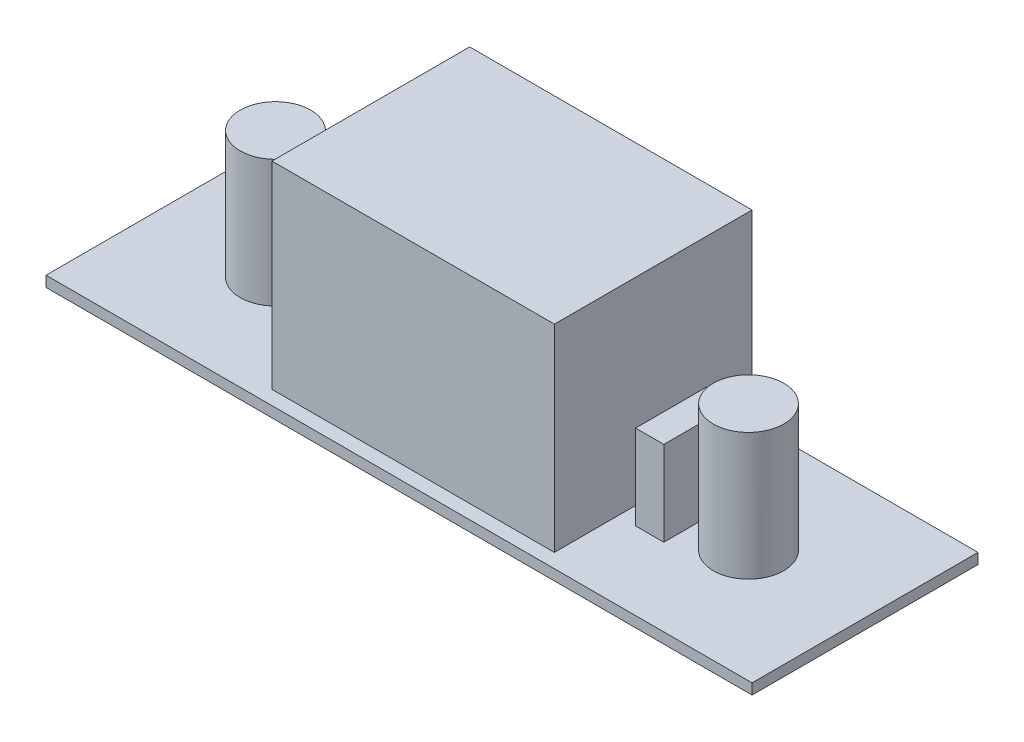
ISO-10303-21;
HEADER;
FILE_DESCRIPTION(('STEP AP214'),'2;1');
FILE_NAME('part.step','',(''),(''),'','','');
FILE_SCHEMA(('AUTOMOTIVE_DESIGN { 1 0 10303 214 1 1 1 1 }'));
ENDSEC;
DATA;
#1=APPLICATION_CONTEXT('core data for automotive mechanical design processes');
#2=APPLICATION_PROTOCOL_DEFINITION('international standard','automotive_design',2000,#1);
#3=PRODUCT_CONTEXT('',#1,'mechanical');
#4=PRODUCT('Part','Part','',(#3));
#5=PRODUCT_RELATED_PRODUCT_CATEGORY('part','',(#4));
#6=PRODUCT_DEFINITION_FORMATION('','',#4);
#7=PRODUCT_DEFINITION_CONTEXT('part definition',#1,'design');
#8=PRODUCT_DEFINITION('design','',#6,#7);
#9=PRODUCT_DEFINITION_SHAPE('','',#8);
#10=(LENGTH_UNIT() NAMED_UNIT(*) SI_UNIT(.MILLI.,.METRE.));
#11=(NAMED_UNIT(*) PLANE_ANGLE_UNIT() SI_UNIT($,.RADIAN.));
#12=(NAMED_UNIT(*) SI_UNIT($,.STERADIAN.) SOLID_ANGLE_UNIT());
#13=UNCERTAINTY_MEASURE_WITH_UNIT(LENGTH_MEASURE(1.E-05),#10,'distance_accuracy_value','');
#14=(GEOMETRIC_REPRESENTATION_CONTEXT(3) GLOBAL_UNCERTAINTY_ASSIGNED_CONTEXT((#13)) GLOBAL_UNIT_ASSIGNED_CONTEXT((#10,
#11,#12)) REPRESENTATION_CONTEXT('',''));
#15=CARTESIAN_POINT('',(0.,0.,0.));
#16=DIRECTION('',(0.,0.,1.));
#17=DIRECTION('',(1.,0.,0.));
#18=AXIS2_PLACEMENT_3D('',#15,#16,#17);
#19=CARTESIAN_POINT('',(0.,1.5,0.));
#20=DIRECTION('',(0.,-1.,0.));
#21=DIRECTION('',(0.,0.,-1.));
#22=AXIS2_PLACEMENT_3D('',#19,#20,#21);
#23=PLANE('',#22);
#24=DIRECTION('',(0.,0.,1.));
#25=VECTOR('',#24,1.);
#26=CARTESIAN_POINT('',(30.,1.5,-2.00081619767594));
#27=LINE('',#26,#25);
#28=CARTESIAN_POINT('',(30.,1.5,-30.0008161976759));
#29=VERTEX_POINT('',#28);
#30=CARTESIAN_POINT('',(30.,1.5,-2.00081619767594));
#31=VERTEX_POINT('',#30);
#32=EDGE_CURVE('E158',#29,#31,#27,.T.);
#33=ORIENTED_EDGE('',*,*,#32,.F.);
#34=DIRECTION('',(-1.,0.,0.));
#35=VECTOR('',#34,1.);
#36=CARTESIAN_POINT('',(30.,1.5,-30.0008161976759));
#37=LINE('',#36,#35);
#38=CARTESIAN_POINT('',(70.,1.5,-30.0008161976759));
#39=VERTEX_POINT('',#38);
#40=EDGE_CURVE('E163',#39,#29,#37,.T.);
#41=ORIENTED_EDGE('',*,*,#40,.F.);
#42=DIRECTION('',(0.,0.,-1.));
#43=VECTOR('',#42,1.);
#44=CARTESIAN_POINT('',(70.,1.5,-2.00081619767594));
#45=LINE('',#44,#43);
#46=CARTESIAN_POINT('',(70.,1.5,-2.00081619767594));
#47=VERTEX_POINT('',#46);
#48=EDGE_CURVE('E175',#47,#39,#45,.T.);
#49=ORIENTED_EDGE('',*,*,#48,.F.);
#50=DIRECTION('',(1.,0.,0.));
#51=VECTOR('',#50,1.);
#52=CARTESIAN_POINT('',(30.,1.5,-2.00081619767594));
#53=LINE('',#52,#51);
#54=EDGE_CURVE('E172',#31,#47,#53,.T.);
#55=ORIENTED_EDGE('',*,*,#54,.F.);
#56=EDGE_LOOP('',(#33,#41,#49,#55));
#57=FACE_BOUND('',#56,.T.);
#58=DIRECTION('',(0.,0.,1.));
#59=VECTOR('',#58,1.);
#60=CARTESIAN_POINT('',(0.,1.5,0.));
#61=LINE('',#60,#59);
#62=CARTESIAN_POINT('',(0.,1.5,-32.));
#63=VERTEX_POINT('',#62);
#64=CARTESIAN_POINT('',(0.,1.5,0.));
#65=VERTEX_POINT('',#64);
#66=EDGE_CURVE('E192',#63,#65,#61,.T.);
#67=ORIENTED_EDGE('',*,*,#66,.T.);
#68=DIRECTION('',(1.,0.,0.));
#69=VECTOR('',#68,1.);
#70=CARTESIAN_POINT('',(0.,1.5,0.));
#71=LINE('',#70,#69);
#72=CARTESIAN_POINT('',(100.,1.5,0.));
#73=VERTEX_POINT('',#72);
#74=EDGE_CURVE('E195',#65,#73,#71,.T.);
#75=ORIENTED_EDGE('',*,*,#74,.T.);
#76=DIRECTION('',(0.,0.,-1.));
#77=VECTOR('',#76,1.);
#78=CARTESIAN_POINT('',(100.,1.5,0.));
#79=LINE('',#78,#77);
#80=CARTESIAN_POINT('',(100.,1.5,-32.));
#81=VERTEX_POINT('',#80);
#82=EDGE_CURVE('E198',#73,#81,#79,.T.);
#83=ORIENTED_EDGE('',*,*,#82,.T.);
#84=DIRECTION('',(-1.,0.,0.));
#85=VECTOR('',#84,1.);
#86=CARTESIAN_POINT('',(0.,1.5,-32.));
#87=LINE('',#86,#85);
#88=EDGE_CURVE('E200',#81,#63,#87,.T.);
#89=ORIENTED_EDGE('',*,*,#88,.T.);
#90=EDGE_LOOP('',(#67,#75,#83,#89));
#91=FACE_BOUND('',#90,.T.);
#92=CARTESIAN_POINT('',(16.5,1.5,-16.));
#93=DIRECTION('',(0.,-1.,0.));
#94=DIRECTION('',(0.,0.,-1.));
#95=AXIS2_PLACEMENT_3D('',#92,#93,#94);
#96=CIRCLE('',#95,5.);
#97=CARTESIAN_POINT('',(16.5,1.5,-21.));
#98=VERTEX_POINT('',#97);
#99=EDGE_CURVE('E45',#98,#98,#96,.F.);
#100=ORIENTED_EDGE('',*,*,#99,.F.);
#101=EDGE_LOOP('',(#100));
#102=FACE_BOUND('',#101,.T.);
#103=CARTESIAN_POINT('',(83.5,1.5,-16.));
#104=DIRECTION('',(0.,-1.,0.));
#105=DIRECTION('',(0.,0.,-1.));
#106=AXIS2_PLACEMENT_3D('',#103,#104,#105);
#107=CIRCLE('',#106,5.);
#108=CARTESIAN_POINT('',(83.5,1.5,-21.));
#109=VERTEX_POINT('',#108);
#110=EDGE_CURVE('E11',#109,#109,#107,.F.);
#111=ORIENTED_EDGE('',*,*,#110,.F.);
#112=EDGE_LOOP('',(#111));
#113=FACE_BOUND('',#112,.T.);
#114=DIRECTION('',(0.,0.,1.));
#115=VECTOR('',#114,1.);
#116=CARTESIAN_POINT('',(72.5,1.5,-21.));
#117=LINE('',#116,#115);
#118=CARTESIAN_POINT('',(72.5,1.5,-21.));
#119=VERTEX_POINT('',#118);
#120=CARTESIAN_POINT('',(72.5,1.5,-11.));
#121=VERTEX_POINT('',#120);
#122=EDGE_CURVE('E146',#119,#121,#117,.T.);
#123=ORIENTED_EDGE('',*,*,#122,.F.);
#124=DIRECTION('',(-1.,0.,0.));
#125=VECTOR('',#124,1.);
#126=CARTESIAN_POINT('',(72.5,1.5,-21.));
#127=LINE('',#126,#125);
#128=CARTESIAN_POINT('',(76.5,1.5,-21.));
#129=VERTEX_POINT('',#128);
#130=EDGE_CURVE('E143',#129,#119,#127,.T.);
#131=ORIENTED_EDGE('',*,*,#130,.F.);
#132=DIRECTION('',(0.,0.,-1.));
#133=VECTOR('',#132,1.);
#134=CARTESIAN_POINT('',(76.5,1.5,-21.));
#135=LINE('',#134,#133);
#136=CARTESIAN_POINT('',(76.5,1.5,-11.));
#137=VERTEX_POINT('',#136);
#138=EDGE_CURVE('E57',#137,#129,#135,.T.);
#139=ORIENTED_EDGE('',*,*,#138,.F.);
#140=DIRECTION('',(1.,0.,0.));
#141=VECTOR('',#140,1.);
#142=CARTESIAN_POINT('',(72.5,1.5,-11.));
#143=LINE('',#142,#141);
#144=EDGE_CURVE('E52',#121,#137,#143,.T.);
#145=ORIENTED_EDGE('',*,*,#144,.F.);
#146=EDGE_LOOP('',(#123,#131,#139,#145));
#147=FACE_BOUND('',#146,.T.);
#148=ADVANCED_FACE('F37',(#57,#91,#102,#113,#147),#23,.F.);
#149=CARTESIAN_POINT('',(0.,1.5,0.));
#150=DIRECTION('',(1.,0.,0.));
#151=DIRECTION('',(0.,0.,-1.));
#152=AXIS2_PLACEMENT_3D('',#149,#150,#151);
#153=PLANE('',#152);
#154=DIRECTION('',(0.,0.,1.));
#155=VECTOR('',#154,1.);
#156=CARTESIAN_POINT('',(0.,0.,0.));
#157=LINE('',#156,#155);
#158=CARTESIAN_POINT('',(0.,0.,-32.));
#159=VERTEX_POINT('',#158);
#160=CARTESIAN_POINT('',(0.,0.,0.));
#161=VERTEX_POINT('',#160);
#162=EDGE_CURVE('E191',#159,#161,#157,.T.);
#163=ORIENTED_EDGE('',*,*,#162,.T.);
#164=DIRECTION('',(0.,-1.,0.));
#165=VECTOR('',#164,1.);
#166=CARTESIAN_POINT('',(0.,1.5,0.));
#167=LINE('',#166,#165);
#168=EDGE_CURVE('E218',#65,#161,#167,.T.);
#169=ORIENTED_EDGE('',*,*,#168,.F.);
#170=ORIENTED_EDGE('',*,*,#66,.F.);
#171=DIRECTION('',(0.,-1.,0.));
#172=VECTOR('',#171,1.);
#173=CARTESIAN_POINT('',(0.,1.5,-32.));
#174=LINE('',#173,#172);
#175=EDGE_CURVE('E202',#63,#159,#174,.T.);
#176=ORIENTED_EDGE('',*,*,#175,.T.);
#177=EDGE_LOOP('',(#163,#169,#170,#176));
#178=FACE_BOUND('',#177,.T.);
#179=ADVANCED_FACE('F39',(#178),#153,.F.);
#180=CARTESIAN_POINT('',(0.,1.5,0.));
#181=DIRECTION('',(0.,0.,-1.));
#182=DIRECTION('',(-1.,0.,0.));
#183=AXIS2_PLACEMENT_3D('',#180,#181,#182);
#184=PLANE('',#183);
#185=DIRECTION('',(1.,0.,0.));
#186=VECTOR('',#185,1.);
#187=CARTESIAN_POINT('',(0.,0.,0.));
#188=LINE('',#187,#186);
#189=CARTESIAN_POINT('',(100.,0.,0.));
#190=VERTEX_POINT('',#189);
#191=EDGE_CURVE('E205',#161,#190,#188,.T.);
#192=ORIENTED_EDGE('',*,*,#191,.T.);
#193=DIRECTION('',(0.,-1.,0.));
#194=VECTOR('',#193,1.);
#195=CARTESIAN_POINT('',(100.,1.5,0.));
#196=LINE('',#195,#194);
#197=EDGE_CURVE('E215',#73,#190,#196,.T.);
#198=ORIENTED_EDGE('',*,*,#197,.F.);
#199=ORIENTED_EDGE('',*,*,#74,.F.);
#200=ORIENTED_EDGE('',*,*,#168,.T.);
#201=EDGE_LOOP('',(#192,#198,#199,#200));
#202=FACE_BOUND('',#201,.T.);
#203=ADVANCED_FACE('F302',(#202),#184,.F.);
#204=CARTESIAN_POINT('',(100.,1.5,0.));
#205=DIRECTION('',(-1.,0.,0.));
#206=DIRECTION('',(0.,0.,1.));
#207=AXIS2_PLACEMENT_3D('',#204,#205,#206);
#208=PLANE('',#207);
#209=DIRECTION('',(0.,0.,-1.));
#210=VECTOR('',#209,1.);
#211=CARTESIAN_POINT('',(100.,0.,0.));
#212=LINE('',#211,#210);
#213=CARTESIAN_POINT('',(100.,0.,-32.));
#214=VERTEX_POINT('',#213);
#215=EDGE_CURVE('E207',#190,#214,#212,.T.);
#216=ORIENTED_EDGE('',*,*,#215,.T.);
#217=DIRECTION('',(0.,-1.,0.));
#218=VECTOR('',#217,1.);
#219=CARTESIAN_POINT('',(100.,1.5,-32.));
#220=LINE('',#219,#218);
#221=EDGE_CURVE('E212',#81,#214,#220,.T.);
#222=ORIENTED_EDGE('',*,*,#221,.F.);
#223=ORIENTED_EDGE('',*,*,#82,.F.);
#224=ORIENTED_EDGE('',*,*,#197,.T.);
#225=EDGE_LOOP('',(#216,#222,#223,#224));
#226=FACE_BOUND('',#225,.T.);
#227=ADVANCED_FACE('F299',(#226),#208,.F.);
#228=CARTESIAN_POINT('',(0.,1.5,-32.));
#229=DIRECTION('',(0.,0.,1.));
#230=DIRECTION('',(1.,0.,0.));
#231=AXIS2_PLACEMENT_3D('',#228,#229,#230);
#232=PLANE('',#231);
#233=DIRECTION('',(-1.,0.,0.));
#234=VECTOR('',#233,1.);
#235=CARTESIAN_POINT('',(0.,0.,-32.));
#236=LINE('',#235,#234);
#237=EDGE_CURVE('E196',#214,#159,#236,.T.);
#238=ORIENTED_EDGE('',*,*,#237,.T.);
#239=ORIENTED_EDGE('',*,*,#175,.F.);
#240=ORIENTED_EDGE('',*,*,#88,.F.);
#241=ORIENTED_EDGE('',*,*,#221,.T.);
#242=EDGE_LOOP('',(#238,#239,#240,#241));
#243=FACE_BOUND('',#242,.T.);
#244=ADVANCED_FACE('F295',(#243),#232,.F.);
#245=CARTESIAN_POINT('',(0.,0.,0.));
#246=DIRECTION('',(0.,-1.,0.));
#247=DIRECTION('',(0.,0.,-1.));
#248=AXIS2_PLACEMENT_3D('',#245,#246,#247);
#249=PLANE('',#248);
#250=ORIENTED_EDGE('',*,*,#162,.F.);
#251=ORIENTED_EDGE('',*,*,#237,.F.);
#252=ORIENTED_EDGE('',*,*,#215,.F.);
#253=ORIENTED_EDGE('',*,*,#191,.F.);
#254=EDGE_LOOP('',(#250,#251,#252,#253));
#255=FACE_BOUND('',#254,.T.);
#256=ADVANCED_FACE('F290',(#255),#249,.T.);
#257=CARTESIAN_POINT('',(30.,29.5,-2.00081619767594));
#258=DIRECTION('',(1.,0.,0.));
#259=DIRECTION('',(0.,0.,-1.));
#260=AXIS2_PLACEMENT_3D('',#257,#258,#259);
#261=PLANE('',#260);
#262=ORIENTED_EDGE('',*,*,#32,.T.);
#263=DIRECTION('',(0.,-1.,0.));
#264=VECTOR('',#263,1.);
#265=CARTESIAN_POINT('',(30.,29.5,-2.00081619767594));
#266=LINE('',#265,#264);
#267=CARTESIAN_POINT('',(30.,29.5,-2.00081619767594));
#268=VERTEX_POINT('',#267);
#269=EDGE_CURVE('E188',#268,#31,#266,.T.);
#270=ORIENTED_EDGE('',*,*,#269,.F.);
#271=DIRECTION('',(0.,0.,1.));
#272=VECTOR('',#271,1.);
#273=CARTESIAN_POINT('',(30.,29.5,-2.00081619767594));
#274=LINE('',#273,#272);
#275=CARTESIAN_POINT('',(30.,29.5,-30.0008161976759));
#276=VERTEX_POINT('',#275);
#277=EDGE_CURVE('E159',#276,#268,#274,.T.);
#278=ORIENTED_EDGE('',*,*,#277,.F.);
#279=DIRECTION('',(0.,-1.,0.));
#280=VECTOR('',#279,1.);
#281=CARTESIAN_POINT('',(30.,29.5,-30.0008161976759));
#282=LINE('',#281,#280);
#283=EDGE_CURVE('E169',#276,#29,#282,.T.);
#284=ORIENTED_EDGE('',*,*,#283,.T.);
#285=EDGE_LOOP('',(#262,#270,#278,#284));
#286=FACE_BOUND('',#285,.T.);
#287=ADVANCED_FACE('F287',(#286),#261,.F.);
#288=CARTESIAN_POINT('',(30.,29.5,-2.00081619767594));
#289=DIRECTION('',(0.,0.,-1.));
#290=DIRECTION('',(-1.,0.,0.));
#291=AXIS2_PLACEMENT_3D('',#288,#289,#290);
#292=PLANE('',#291);
#293=ORIENTED_EDGE('',*,*,#54,.T.);
#294=DIRECTION('',(0.,-1.,0.));
#295=VECTOR('',#294,1.);
#296=CARTESIAN_POINT('',(70.,29.5,-2.00081619767594));
#297=LINE('',#296,#295);
#298=CARTESIAN_POINT('',(70.,29.5,-2.00081619767594));
#299=VERTEX_POINT('',#298);
#300=EDGE_CURVE('E185',#299,#47,#297,.T.);
#301=ORIENTED_EDGE('',*,*,#300,.F.);
#302=DIRECTION('',(1.,0.,0.));
#303=VECTOR('',#302,1.);
#304=CARTESIAN_POINT('',(30.,29.5,-2.00081619767594));
#305=LINE('',#304,#303);
#306=EDGE_CURVE('E162',#268,#299,#305,.T.);
#307=ORIENTED_EDGE('',*,*,#306,.F.);
#308=ORIENTED_EDGE('',*,*,#269,.T.);
#309=EDGE_LOOP('',(#293,#301,#307,#308));
#310=FACE_BOUND('',#309,.T.);
#311=ADVANCED_FACE('F283',(#310),#292,.F.);
#312=CARTESIAN_POINT('',(70.,29.5,-2.00081619767594));
#313=DIRECTION('',(-1.,0.,0.));
#314=DIRECTION('',(0.,0.,1.));
#315=AXIS2_PLACEMENT_3D('',#312,#313,#314);
#316=PLANE('',#315);
#317=ORIENTED_EDGE('',*,*,#48,.T.);
#318=DIRECTION('',(0.,-1.,0.));
#319=VECTOR('',#318,1.);
#320=CARTESIAN_POINT('',(70.,29.5,-30.0008161976759));
#321=LINE('',#320,#319);
#322=CARTESIAN_POINT('',(70.,29.5,-30.0008161976759));
#323=VERTEX_POINT('',#322);
#324=EDGE_CURVE('E182',#323,#39,#321,.T.);
#325=ORIENTED_EDGE('',*,*,#324,.F.);
#326=DIRECTION('',(0.,0.,-1.));
#327=VECTOR('',#326,1.);
#328=CARTESIAN_POINT('',(70.,29.5,-2.00081619767594));
#329=LINE('',#328,#327);
#330=EDGE_CURVE('E165',#299,#323,#329,.T.);
#331=ORIENTED_EDGE('',*,*,#330,.F.);
#332=ORIENTED_EDGE('',*,*,#300,.T.);
#333=EDGE_LOOP('',(#317,#325,#331,#332));
#334=FACE_BOUND('',#333,.T.);
#335=ADVANCED_FACE('F279',(#334),#316,.F.);
#336=CARTESIAN_POINT('',(30.,29.5,-30.0008161976759));
#337=DIRECTION('',(0.,0.,1.));
#338=DIRECTION('',(1.,0.,0.));
#339=AXIS2_PLACEMENT_3D('',#336,#337,#338);
#340=PLANE('',#339);
#341=ORIENTED_EDGE('',*,*,#40,.T.);
#342=ORIENTED_EDGE('',*,*,#283,.F.);
#343=DIRECTION('',(-1.,0.,0.));
#344=VECTOR('',#343,1.);
#345=CARTESIAN_POINT('',(30.,29.5,-30.0008161976759));
#346=LINE('',#345,#344);
#347=EDGE_CURVE('E167',#323,#276,#346,.T.);
#348=ORIENTED_EDGE('',*,*,#347,.F.);
#349=ORIENTED_EDGE('',*,*,#324,.T.);
#350=EDGE_LOOP('',(#341,#342,#348,#349));
#351=FACE_BOUND('',#350,.T.);
#352=ADVANCED_FACE('F275',(#351),#340,.F.);
#353=CARTESIAN_POINT('',(0.,29.5,0.));
#354=DIRECTION('',(0.,-1.,0.));
#355=DIRECTION('',(0.,0.,-1.));
#356=AXIS2_PLACEMENT_3D('',#353,#354,#355);
#357=PLANE('',#356);
#358=ORIENTED_EDGE('',*,*,#277,.T.);
#359=ORIENTED_EDGE('',*,*,#306,.T.);
#360=ORIENTED_EDGE('',*,*,#330,.T.);
#361=ORIENTED_EDGE('',*,*,#347,.T.);
#362=EDGE_LOOP('',(#358,#359,#360,#361));
#363=FACE_BOUND('',#362,.T.);
#364=ADVANCED_FACE('F271',(#363),#357,.F.);
#365=CARTESIAN_POINT('',(16.5,19.5,-16.));
#366=DIRECTION('',(0.,-1.,0.));
#367=DIRECTION('',(0.,0.,-1.));
#368=AXIS2_PLACEMENT_3D('',#365,#366,#367);
#369=CYLINDRICAL_SURFACE('',#368,5.);
#370=CARTESIAN_POINT('',(16.5,19.5,-16.));
#371=DIRECTION('',(0.,1.,0.));
#372=DIRECTION('',(0.,0.,1.));
#373=AXIS2_PLACEMENT_3D('',#370,#371,#372);
#374=CIRCLE('',#373,5.);
#375=CARTESIAN_POINT('',(16.5,19.5,-11.));
#376=VERTEX_POINT('',#375);
#377=EDGE_CURVE('E150',#376,#376,#374,.T.);
#378=ORIENTED_EDGE('',*,*,#377,.F.);
#379=EDGE_LOOP('',(#378));
#380=FACE_BOUND('',#379,.T.);
#381=ORIENTED_EDGE('',*,*,#99,.T.);
#382=EDGE_LOOP('',(#381));
#383=FACE_BOUND('',#382,.T.);
#384=ADVANCED_FACE('F223',(#380,#383),#369,.T.);
#385=CARTESIAN_POINT('',(16.5,19.5,-16.));
#386=DIRECTION('',(0.,1.,0.));
#387=DIRECTION('',(0.,0.,1.));
#388=AXIS2_PLACEMENT_3D('',#385,#386,#387);
#389=PLANE('',#388);
#390=ORIENTED_EDGE('',*,*,#377,.T.);
#391=EDGE_LOOP('',(#390));
#392=FACE_BOUND('',#391,.T.);
#393=ADVANCED_FACE('F264',(#392),#389,.T.);
#394=CARTESIAN_POINT('',(83.5,19.5,-16.));
#395=DIRECTION('',(0.,-1.,0.));
#396=DIRECTION('',(0.,0.,-1.));
#397=AXIS2_PLACEMENT_3D('',#394,#395,#396);
#398=CYLINDRICAL_SURFACE('',#397,5.);
#399=CARTESIAN_POINT('',(83.5,19.5,-16.));
#400=DIRECTION('',(0.,1.,0.));
#401=DIRECTION('',(0.,0.,1.));
#402=AXIS2_PLACEMENT_3D('',#399,#400,#401);
#403=CIRCLE('',#402,5.);
#404=CARTESIAN_POINT('',(83.5,19.5,-11.));
#405=VERTEX_POINT('',#404);
#406=EDGE_CURVE('E147',#405,#405,#403,.T.);
#407=ORIENTED_EDGE('',*,*,#406,.F.);
#408=EDGE_LOOP('',(#407));
#409=FACE_BOUND('',#408,.T.);
#410=ORIENTED_EDGE('',*,*,#110,.T.);
#411=EDGE_LOOP('',(#410));
#412=FACE_BOUND('',#411,.T.);
#413=ADVANCED_FACE('F260',(#409,#412),#398,.T.);
#414=CARTESIAN_POINT('',(83.5,19.5,-16.));
#415=DIRECTION('',(0.,1.,0.));
#416=DIRECTION('',(0.,0.,1.));
#417=AXIS2_PLACEMENT_3D('',#414,#415,#416);
#418=PLANE('',#417);
#419=ORIENTED_EDGE('',*,*,#406,.T.);
#420=EDGE_LOOP('',(#419));
#421=FACE_BOUND('',#420,.T.);
#422=ADVANCED_FACE('F257',(#421),#418,.T.);
#423=CARTESIAN_POINT('',(72.5,13.5,-21.));
#424=DIRECTION('',(1.,0.,0.));
#425=DIRECTION('',(0.,0.,-1.));
#426=AXIS2_PLACEMENT_3D('',#423,#424,#425);
#427=PLANE('',#426);
#428=ORIENTED_EDGE('',*,*,#122,.T.);
#429=DIRECTION('',(0.,-1.,0.));
#430=VECTOR('',#429,1.);
#431=CARTESIAN_POINT('',(72.5,13.5,-11.));
#432=LINE('',#431,#430);
#433=CARTESIAN_POINT('',(72.5,13.5,-11.));
#434=VERTEX_POINT('',#433);
#435=EDGE_CURVE('E127',#434,#121,#432,.T.);
#436=ORIENTED_EDGE('',*,*,#435,.F.);
#437=DIRECTION('',(0.,0.,1.));
#438=VECTOR('',#437,1.);
#439=CARTESIAN_POINT('',(72.5,13.5,-21.));
#440=LINE('',#439,#438);
#441=CARTESIAN_POINT('',(72.5,13.5,-21.));
#442=VERTEX_POINT('',#441);
#443=EDGE_CURVE('E134',#442,#434,#440,.T.);
#444=ORIENTED_EDGE('',*,*,#443,.F.);
#445=DIRECTION('',(0.,-1.,0.));
#446=VECTOR('',#445,1.);
#447=CARTESIAN_POINT('',(72.5,13.5,-21.));
#448=LINE('',#447,#446);
#449=EDGE_CURVE('E235',#442,#119,#448,.T.);
#450=ORIENTED_EDGE('',*,*,#449,.T.);
#451=EDGE_LOOP('',(#428,#436,#444,#450));
#452=FACE_BOUND('',#451,.T.);
#453=ADVANCED_FACE('F145',(#452),#427,.F.);
#454=CARTESIAN_POINT('',(72.5,13.5,-11.));
#455=DIRECTION('',(0.,0.,-1.));
#456=DIRECTION('',(-1.,0.,0.));
#457=AXIS2_PLACEMENT_3D('',#454,#455,#456);
#458=PLANE('',#457);
#459=ORIENTED_EDGE('',*,*,#144,.T.);
#460=DIRECTION('',(0.,-1.,0.));
#461=VECTOR('',#460,1.);
#462=CARTESIAN_POINT('',(76.5,13.5,-11.));
#463=LINE('',#462,#461);
#464=CARTESIAN_POINT('',(76.5,13.5,-11.));
#465=VERTEX_POINT('',#464);
#466=EDGE_CURVE('E130',#465,#137,#463,.T.);
#467=ORIENTED_EDGE('',*,*,#466,.F.);
#468=DIRECTION('',(1.,0.,0.));
#469=VECTOR('',#468,1.);
#470=CARTESIAN_POINT('',(72.5,13.5,-11.));
#471=LINE('',#470,#469);
#472=EDGE_CURVE('E123',#434,#465,#471,.T.);
#473=ORIENTED_EDGE('',*,*,#472,.F.);
#474=ORIENTED_EDGE('',*,*,#435,.T.);
#475=EDGE_LOOP('',(#459,#467,#473,#474));
#476=FACE_BOUND('',#475,.T.);
#477=ADVANCED_FACE('F125',(#476),#458,.F.);
#478=CARTESIAN_POINT('',(76.5,13.5,-21.));
#479=DIRECTION('',(-1.,0.,0.));
#480=DIRECTION('',(0.,0.,1.));
#481=AXIS2_PLACEMENT_3D('',#478,#479,#480);
#482=PLANE('',#481);
#483=ORIENTED_EDGE('',*,*,#138,.T.);
#484=DIRECTION('',(0.,-1.,0.));
#485=VECTOR('',#484,1.);
#486=CARTESIAN_POINT('',(76.5,13.5,-21.));
#487=LINE('',#486,#485);
#488=CARTESIAN_POINT('',(76.5,13.5,-21.));
#489=VERTEX_POINT('',#488);
#490=EDGE_CURVE('E152',#489,#129,#487,.T.);
#491=ORIENTED_EDGE('',*,*,#490,.F.);
#492=DIRECTION('',(0.,0.,-1.));
#493=VECTOR('',#492,1.);
#494=CARTESIAN_POINT('',(76.5,13.5,-21.));
#495=LINE('',#494,#493);
#496=EDGE_CURVE('E133',#465,#489,#495,.T.);
#497=ORIENTED_EDGE('',*,*,#496,.F.);
#498=ORIENTED_EDGE('',*,*,#466,.T.);
#499=EDGE_LOOP('',(#483,#491,#497,#498));
#500=FACE_BOUND('',#499,.T.);
#501=ADVANCED_FACE('F244',(#500),#482,.F.);
#502=CARTESIAN_POINT('',(72.5,13.5,-21.));
#503=DIRECTION('',(0.,0.,1.));
#504=DIRECTION('',(1.,0.,0.));
#505=AXIS2_PLACEMENT_3D('',#502,#503,#504);
#506=PLANE('',#505);
#507=ORIENTED_EDGE('',*,*,#130,.T.);
#508=ORIENTED_EDGE('',*,*,#449,.F.);
#509=DIRECTION('',(-1.,0.,0.));
#510=VECTOR('',#509,1.);
#511=CARTESIAN_POINT('',(72.5,13.5,-21.));
#512=LINE('',#511,#510);
#513=EDGE_CURVE('E139',#489,#442,#512,.T.);
#514=ORIENTED_EDGE('',*,*,#513,.F.);
#515=ORIENTED_EDGE('',*,*,#490,.T.);
#516=EDGE_LOOP('',(#507,#508,#514,#515));
#517=FACE_BOUND('',#516,.T.);
#518=ADVANCED_FACE('F234',(#517),#506,.F.);
#519=CARTESIAN_POINT('',(0.,13.5,0.));
#520=DIRECTION('',(0.,1.,0.));
#521=DIRECTION('',(0.,0.,1.));
#522=AXIS2_PLACEMENT_3D('',#519,#520,#521);
#523=PLANE('',#522);
#524=ORIENTED_EDGE('',*,*,#443,.T.);
#525=ORIENTED_EDGE('',*,*,#472,.T.);
#526=ORIENTED_EDGE('',*,*,#496,.T.);
#527=ORIENTED_EDGE('',*,*,#513,.T.);
#528=EDGE_LOOP('',(#524,#525,#526,#527));
#529=FACE_BOUND('',#528,.T.);
#530=ADVANCED_FACE('F137',(#529),#523,.T.);
#531=CLOSED_SHELL('',(#148,#179,#203,#227,#244,#256,#287,#311,#335,#352,#364,#384,#393,#413,
#422,#453,#477,#501,#518,#530));
#532=MANIFOLD_SOLID_BREP('B2',#531);
#533=ADVANCED_BREP_SHAPE_REPRESENTATION('',(#18,#532),#14);
#534=SHAPE_DEFINITION_REPRESENTATION(#9,#533);
ENDSEC;
END-ISO-10303-21;
